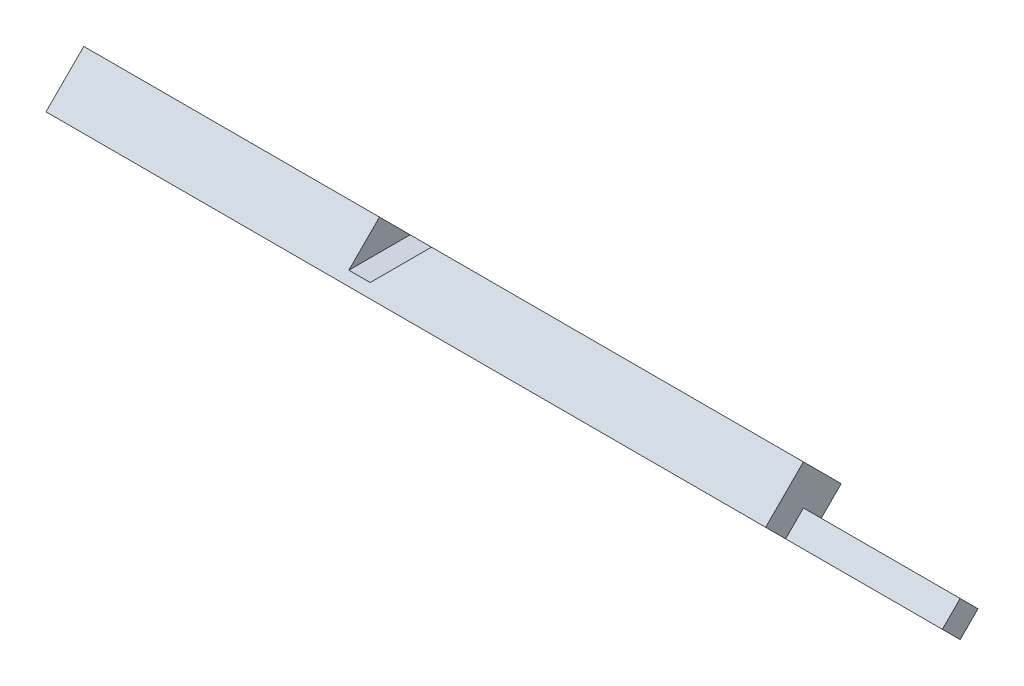
ISO-10303-21;
HEADER;
FILE_DESCRIPTION(('STEP AP214'),'2;1');
FILE_NAME('part.step','',(''),(''),'','','');
FILE_SCHEMA(('AUTOMOTIVE_DESIGN { 1 0 10303 214 1 1 1 1 }'));
ENDSEC;
DATA;
#1=APPLICATION_CONTEXT('core data for automotive mechanical design processes');
#2=APPLICATION_PROTOCOL_DEFINITION('international standard','automotive_design',2000,#1);
#3=PRODUCT_CONTEXT('',#1,'mechanical');
#4=PRODUCT('Part','Part','',(#3));
#5=PRODUCT_RELATED_PRODUCT_CATEGORY('part','',(#4));
#6=PRODUCT_DEFINITION_FORMATION('','',#4);
#7=PRODUCT_DEFINITION_CONTEXT('part definition',#1,'design');
#8=PRODUCT_DEFINITION('design','',#6,#7);
#9=PRODUCT_DEFINITION_SHAPE('','',#8);
#10=(LENGTH_UNIT() NAMED_UNIT(*) SI_UNIT(.MILLI.,.METRE.));
#11=(NAMED_UNIT(*) PLANE_ANGLE_UNIT() SI_UNIT($,.RADIAN.));
#12=(NAMED_UNIT(*) SI_UNIT($,.STERADIAN.) SOLID_ANGLE_UNIT());
#13=UNCERTAINTY_MEASURE_WITH_UNIT(LENGTH_MEASURE(1.E-05),#10,'distance_accuracy_value','');
#14=(GEOMETRIC_REPRESENTATION_CONTEXT(3) GLOBAL_UNCERTAINTY_ASSIGNED_CONTEXT((#13)) GLOBAL_UNIT_ASSIGNED_CONTEXT((#10,
#11,#12)) REPRESENTATION_CONTEXT('',''));
#15=CARTESIAN_POINT('',(0.,0.,0.));
#16=DIRECTION('',(0.,0.,1.));
#17=DIRECTION('',(1.,0.,0.));
#18=AXIS2_PLACEMENT_3D('',#15,#16,#17);
#19=CARTESIAN_POINT('',(101.,0.,-5.3033008588991));
#20=DIRECTION('',(0.,-0.707106781186548,0.707106781186547));
#21=DIRECTION('',(0.,-0.707106781186547,-0.707106781186548));
#22=AXIS2_PLACEMENT_3D('',#19,#20,#21);
#23=PLANE('',#22);
#24=DIRECTION('',(-1.,0.,0.));
#25=VECTOR('',#24,1.);
#26=CARTESIAN_POINT('',(0.,1.,-4.30330085889911));
#27=LINE('',#26,#25);
#28=CARTESIAN_POINT('',(44.5,1.,-4.30330085889911));
#29=VERTEX_POINT('',#28);
#30=CARTESIAN_POINT('',(41.5,1.,-4.30330085889911));
#31=VERTEX_POINT('',#30);
#32=EDGE_CURVE('E127',#29,#31,#27,.T.);
#33=ORIENTED_EDGE('',*,*,#32,.F.);
#34=DIRECTION('',(0.577350269189622,0.577350269189628,0.577350269189628));
#35=VECTOR('',#34,1.);
#36=CARTESIAN_POINT('',(62.6666666666664,19.1666666666666,13.8633658077675));
#37=LINE('',#36,#35);
#38=CARTESIAN_POINT('',(48.8033008588991,5.3033008588991,0.));
#39=VERTEX_POINT('',#38);
#40=EDGE_CURVE('E112',#29,#39,#37,.T.);
#41=ORIENTED_EDGE('',*,*,#40,.T.);
#42=DIRECTION('',(-1.,0.,0.));
#43=VECTOR('',#42,1.);
#44=CARTESIAN_POINT('',(101.,5.30330085889911,0.));
#45=LINE('',#44,#43);
#46=CARTESIAN_POINT('',(101.,5.30330085889911,0.));
#47=VERTEX_POINT('',#46);
#48=EDGE_CURVE('E41',#47,#39,#45,.T.);
#49=ORIENTED_EDGE('',*,*,#48,.F.);
#50=DIRECTION('',(0.,0.707106781186547,0.707106781186548));
#51=VECTOR('',#50,1.);
#52=CARTESIAN_POINT('',(101.,0.,-5.3033008588991));
#53=LINE('',#52,#51);
#54=CARTESIAN_POINT('',(101.,0.,-5.3033008588991));
#55=VERTEX_POINT('',#54);
#56=EDGE_CURVE('E154',#55,#47,#53,.T.);
#57=ORIENTED_EDGE('',*,*,#56,.F.);
#58=DIRECTION('',(-1.,0.,0.));
#59=VECTOR('',#58,1.);
#60=CARTESIAN_POINT('',(101.,0.,-5.3033008588991));
#61=LINE('',#60,#59);
#62=CARTESIAN_POINT('',(0.,0.,-5.3033008588991));
#63=VERTEX_POINT('',#62);
#64=EDGE_CURVE('E11',#55,#63,#61,.T.);
#65=ORIENTED_EDGE('',*,*,#64,.T.);
#66=DIRECTION('',(0.,0.707106781186547,0.707106781186548));
#67=VECTOR('',#66,1.);
#68=CARTESIAN_POINT('',(0.,0.,-5.3033008588991));
#69=LINE('',#68,#67);
#70=CARTESIAN_POINT('',(0.,5.30330085889911,0.));
#71=VERTEX_POINT('',#70);
#72=EDGE_CURVE('E145',#63,#71,#69,.T.);
#73=ORIENTED_EDGE('',*,*,#72,.T.);
#74=CARTESIAN_POINT('',(41.5,5.3033008588991,0.));
#75=VERTEX_POINT('',#74);
#76=EDGE_CURVE('E132',#75,#71,#45,.T.);
#77=ORIENTED_EDGE('',*,*,#76,.F.);
#78=DIRECTION('',(0.,-0.707106781186547,-0.707106781186548));
#79=VECTOR('',#78,1.);
#80=CARTESIAN_POINT('',(41.5,2.65215042944955,-2.65115042944955));
#81=LINE('',#80,#79);
#82=EDGE_CURVE('E186',#75,#31,#81,.T.);
#83=ORIENTED_EDGE('',*,*,#82,.T.);
#84=EDGE_LOOP('',(#33,#41,#49,#57,#65,#73,#77,#83));
#85=FACE_BOUND('',#84,.T.);
#86=ADVANCED_FACE('F33',(#85),#23,.F.);
#87=CARTESIAN_POINT('',(101.,5.30330085889911,0.));
#88=DIRECTION('',(0.,-0.707106781186547,-0.707106781186548));
#89=DIRECTION('',(0.,0.707106781186548,-0.707106781186547));
#90=AXIS2_PLACEMENT_3D('',#87,#88,#89);
#91=PLANE('',#90);
#92=ORIENTED_EDGE('',*,*,#48,.T.);
#93=DIRECTION('',(-0.577350269189622,-0.577350269189628,0.577350269189628));
#94=VECTOR('',#93,1.);
#95=CARTESIAN_POINT('',(66.2022005725991,22.7022005725994,-17.3988997137002));
#96=LINE('',#95,#94);
#97=CARTESIAN_POINT('',(44.5,1.,4.3033008588991));
#98=VERTEX_POINT('',#97);
#99=EDGE_CURVE('E109',#39,#98,#96,.T.);
#100=ORIENTED_EDGE('',*,*,#99,.T.);
#101=DIRECTION('',(1.,0.,0.));
#102=VECTOR('',#101,1.);
#103=CARTESIAN_POINT('',(0.,1.,4.30330085889911));
#104=LINE('',#103,#102);
#105=CARTESIAN_POINT('',(41.5,1.,4.30330085889911));
#106=VERTEX_POINT('',#105);
#107=EDGE_CURVE('E181',#106,#98,#104,.T.);
#108=ORIENTED_EDGE('',*,*,#107,.F.);
#109=DIRECTION('',(0.,0.707106781186548,-0.707106781186547));
#110=VECTOR('',#109,1.);
#111=CARTESIAN_POINT('',(41.5,7.95545128834866,-2.65215042944955));
#112=LINE('',#111,#110);
#113=EDGE_CURVE('E48',#106,#75,#112,.T.);
#114=ORIENTED_EDGE('',*,*,#113,.T.);
#115=ORIENTED_EDGE('',*,*,#76,.T.);
#116=DIRECTION('',(0.,-0.707106781186548,0.707106781186547));
#117=VECTOR('',#116,1.);
#118=CARTESIAN_POINT('',(0.,5.30330085889911,0.));
#119=LINE('',#118,#117);
#120=CARTESIAN_POINT('',(0.,0.,5.30330085889911));
#121=VERTEX_POINT('',#120);
#122=EDGE_CURVE('E143',#71,#121,#119,.T.);
#123=ORIENTED_EDGE('',*,*,#122,.T.);
#124=DIRECTION('',(-1.,0.,0.));
#125=VECTOR('',#124,1.);
#126=CARTESIAN_POINT('',(101.,0.,5.30330085889911));
#127=LINE('',#126,#125);
#128=CARTESIAN_POINT('',(101.,0.,5.30330085889911));
#129=VERTEX_POINT('',#128);
#130=EDGE_CURVE('E133',#129,#121,#127,.T.);
#131=ORIENTED_EDGE('',*,*,#130,.F.);
#132=DIRECTION('',(0.,-0.707106781186548,0.707106781186547));
#133=VECTOR('',#132,1.);
#134=CARTESIAN_POINT('',(101.,5.30330085889911,0.));
#135=LINE('',#134,#133);
#136=EDGE_CURVE('E131',#47,#129,#135,.T.);
#137=ORIENTED_EDGE('',*,*,#136,.F.);
#138=EDGE_LOOP('',(#92,#100,#108,#114,#115,#123,#131,#137));
#139=FACE_BOUND('',#138,.T.);
#140=ADVANCED_FACE('F129',(#139),#91,.F.);
#141=CARTESIAN_POINT('',(101.,0.,0.));
#142=DIRECTION('',(-1.,0.,0.));
#143=DIRECTION('',(0.,0.,1.));
#144=AXIS2_PLACEMENT_3D('',#141,#142,#143);
#145=PLANE('',#144);
#146=DIRECTION('',(0.,-0.707106781186548,0.707106781186547));
#147=VECTOR('',#146,1.);
#148=CARTESIAN_POINT('',(101.,-2.80330085889911,2.5));
#149=LINE('',#148,#147);
#150=CARTESIAN_POINT('',(101.,-0.303300858899107,0.));
#151=VERTEX_POINT('',#150);
#152=CARTESIAN_POINT('',(101.,-2.80330085889911,2.5));
#153=VERTEX_POINT('',#152);
#154=EDGE_CURVE('E166',#151,#153,#149,.T.);
#155=ORIENTED_EDGE('',*,*,#154,.F.);
#156=DIRECTION('',(0.,0.707106781186548,0.707106781186548));
#157=VECTOR('',#156,1.);
#158=CARTESIAN_POINT('',(101.,-2.80330085889911,-2.5));
#159=LINE('',#158,#157);
#160=CARTESIAN_POINT('',(101.,-2.80330085889911,-2.5));
#161=VERTEX_POINT('',#160);
#162=EDGE_CURVE('E169',#161,#151,#159,.T.);
#163=ORIENTED_EDGE('',*,*,#162,.F.);
#164=DIRECTION('',(0.,0.707106781186548,-0.707106781186547));
#165=VECTOR('',#164,1.);
#166=CARTESIAN_POINT('',(101.,0.,-5.3033008588991));
#167=LINE('',#166,#165);
#168=EDGE_CURVE('E142',#161,#55,#167,.T.);
#169=ORIENTED_EDGE('',*,*,#168,.T.);
#170=ORIENTED_EDGE('',*,*,#56,.T.);
#171=ORIENTED_EDGE('',*,*,#136,.T.);
#172=DIRECTION('',(0.,-0.707106781186547,-0.707106781186548));
#173=VECTOR('',#172,1.);
#174=CARTESIAN_POINT('',(101.,-5.30330085889911,0.));
#175=LINE('',#174,#173);
#176=EDGE_CURVE('E56',#129,#153,#175,.T.);
#177=ORIENTED_EDGE('',*,*,#176,.T.);
#178=EDGE_LOOP('',(#155,#163,#169,#170,#171,#177));
#179=FACE_BOUND('',#178,.T.);
#180=ADVANCED_FACE('F203',(#179),#145,.F.);
#181=CARTESIAN_POINT('',(101.,0.,-5.3033008588991));
#182=DIRECTION('',(0.,0.707106781186547,0.707106781186548));
#183=DIRECTION('',(0.,-0.707106781186548,0.707106781186547));
#184=AXIS2_PLACEMENT_3D('',#181,#182,#183);
#185=PLANE('',#184);
#186=DIRECTION('',(0.,0.707106781186548,-0.707106781186547));
#187=VECTOR('',#186,1.);
#188=CARTESIAN_POINT('',(0.,0.,-5.3033008588991));
#189=LINE('',#188,#187);
#190=CARTESIAN_POINT('',(0.,-5.30330085889911,0.));
#191=VERTEX_POINT('',#190);
#192=EDGE_CURVE('E148',#191,#63,#189,.T.);
#193=ORIENTED_EDGE('',*,*,#192,.T.);
#194=ORIENTED_EDGE('',*,*,#64,.F.);
#195=ORIENTED_EDGE('',*,*,#168,.F.);
#196=DIRECTION('',(-1.,0.,0.));
#197=VECTOR('',#196,1.);
#198=CARTESIAN_POINT('',(123.,-2.80330085889911,-2.5));
#199=LINE('',#198,#197);
#200=CARTESIAN_POINT('',(123.,-2.80330085889911,-2.5));
#201=VERTEX_POINT('',#200);
#202=EDGE_CURVE('E151',#201,#161,#199,.T.);
#203=ORIENTED_EDGE('',*,*,#202,.F.);
#204=DIRECTION('',(0.,0.707106781186548,-0.707106781186547));
#205=VECTOR('',#204,1.);
#206=CARTESIAN_POINT('',(123.,-5.30330085889911,0.));
#207=LINE('',#206,#205);
#208=CARTESIAN_POINT('',(123.,-5.30330085889911,0.));
#209=VERTEX_POINT('',#208);
#210=EDGE_CURVE('E168',#209,#201,#207,.T.);
#211=ORIENTED_EDGE('',*,*,#210,.F.);
#212=DIRECTION('',(-1.,0.,0.));
#213=VECTOR('',#212,1.);
#214=CARTESIAN_POINT('',(101.,-5.30330085889911,0.));
#215=LINE('',#214,#213);
#216=EDGE_CURVE('E137',#209,#191,#215,.T.);
#217=ORIENTED_EDGE('',*,*,#216,.T.);
#218=EDGE_LOOP('',(#193,#194,#195,#203,#211,#217));
#219=FACE_BOUND('',#218,.T.);
#220=ADVANCED_FACE('F35',(#219),#185,.F.);
#221=CARTESIAN_POINT('',(101.,-5.30330085889911,0.));
#222=DIRECTION('',(0.,0.707106781186548,-0.707106781186547));
#223=DIRECTION('',(0.,0.707106781186547,0.707106781186548));
#224=AXIS2_PLACEMENT_3D('',#221,#222,#223);
#225=PLANE('',#224);
#226=DIRECTION('',(0.,-0.707106781186547,-0.707106781186548));
#227=VECTOR('',#226,1.);
#228=CARTESIAN_POINT('',(0.,-5.30330085889911,0.));
#229=LINE('',#228,#227);
#230=EDGE_CURVE('E140',#121,#191,#229,.T.);
#231=ORIENTED_EDGE('',*,*,#230,.T.);
#232=ORIENTED_EDGE('',*,*,#216,.F.);
#233=DIRECTION('',(0.,-0.707106781186547,-0.707106781186548));
#234=VECTOR('',#233,1.);
#235=CARTESIAN_POINT('',(123.,-5.30330085889911,0.));
#236=LINE('',#235,#234);
#237=CARTESIAN_POINT('',(123.,-2.80330085889911,2.5));
#238=VERTEX_POINT('',#237);
#239=EDGE_CURVE('E165',#238,#209,#236,.T.);
#240=ORIENTED_EDGE('',*,*,#239,.F.);
#241=DIRECTION('',(-1.,0.,0.));
#242=VECTOR('',#241,1.);
#243=CARTESIAN_POINT('',(123.,-2.80330085889911,2.5));
#244=LINE('',#243,#242);
#245=EDGE_CURVE('E162',#238,#153,#244,.T.);
#246=ORIENTED_EDGE('',*,*,#245,.T.);
#247=ORIENTED_EDGE('',*,*,#176,.F.);
#248=ORIENTED_EDGE('',*,*,#130,.T.);
#249=EDGE_LOOP('',(#231,#232,#240,#246,#247,#248));
#250=FACE_BOUND('',#249,.T.);
#251=ADVANCED_FACE('F196',(#250),#225,.F.);
#252=CARTESIAN_POINT('',(0.,0.,0.));
#253=DIRECTION('',(-1.,0.,0.));
#254=DIRECTION('',(0.,0.,1.));
#255=AXIS2_PLACEMENT_3D('',#252,#253,#254);
#256=PLANE('',#255);
#257=ORIENTED_EDGE('',*,*,#192,.F.);
#258=ORIENTED_EDGE('',*,*,#230,.F.);
#259=ORIENTED_EDGE('',*,*,#122,.F.);
#260=ORIENTED_EDGE('',*,*,#72,.F.);
#261=EDGE_LOOP('',(#257,#258,#259,#260));
#262=FACE_BOUND('',#261,.T.);
#263=ADVANCED_FACE('F194',(#262),#256,.T.);
#264=CARTESIAN_POINT('',(123.,-2.80330085889911,-2.5));
#265=DIRECTION('',(0.,-0.707106781186548,0.707106781186548));
#266=DIRECTION('',(0.,-0.707106781186548,-0.707106781186548));
#267=AXIS2_PLACEMENT_3D('',#264,#265,#266);
#268=PLANE('',#267);
#269=ORIENTED_EDGE('',*,*,#162,.T.);
#270=DIRECTION('',(-1.,0.,0.));
#271=VECTOR('',#270,1.);
#272=CARTESIAN_POINT('',(123.,-0.303300858899107,0.));
#273=LINE('',#272,#271);
#274=CARTESIAN_POINT('',(123.,-0.303300858899107,0.));
#275=VERTEX_POINT('',#274);
#276=EDGE_CURVE('E159',#275,#151,#273,.T.);
#277=ORIENTED_EDGE('',*,*,#276,.F.);
#278=DIRECTION('',(0.,0.707106781186548,0.707106781186548));
#279=VECTOR('',#278,1.);
#280=CARTESIAN_POINT('',(123.,-2.80330085889911,-2.5));
#281=LINE('',#280,#279);
#282=EDGE_CURVE('E176',#201,#275,#281,.T.);
#283=ORIENTED_EDGE('',*,*,#282,.F.);
#284=ORIENTED_EDGE('',*,*,#202,.T.);
#285=EDGE_LOOP('',(#269,#277,#283,#284));
#286=FACE_BOUND('',#285,.T.);
#287=ADVANCED_FACE('F206',(#286),#268,.F.);
#288=CARTESIAN_POINT('',(123.,-2.80330085889911,2.5));
#289=DIRECTION('',(0.,-0.707106781186547,-0.707106781186548));
#290=DIRECTION('',(0.,0.707106781186548,-0.707106781186547));
#291=AXIS2_PLACEMENT_3D('',#288,#289,#290);
#292=PLANE('',#291);
#293=ORIENTED_EDGE('',*,*,#154,.T.);
#294=ORIENTED_EDGE('',*,*,#245,.F.);
#295=DIRECTION('',(0.,-0.707106781186548,0.707106781186547));
#296=VECTOR('',#295,1.);
#297=CARTESIAN_POINT('',(123.,-2.80330085889911,2.5));
#298=LINE('',#297,#296);
#299=EDGE_CURVE('E174',#275,#238,#298,.T.);
#300=ORIENTED_EDGE('',*,*,#299,.F.);
#301=ORIENTED_EDGE('',*,*,#276,.T.);
#302=EDGE_LOOP('',(#293,#294,#300,#301));
#303=FACE_BOUND('',#302,.T.);
#304=ADVANCED_FACE('F201',(#303),#292,.F.);
#305=CARTESIAN_POINT('',(123.,0.,0.));
#306=DIRECTION('',(1.,0.,0.));
#307=DIRECTION('',(0.,0.,-1.));
#308=AXIS2_PLACEMENT_3D('',#305,#306,#307);
#309=PLANE('',#308);
#310=ORIENTED_EDGE('',*,*,#210,.T.);
#311=ORIENTED_EDGE('',*,*,#282,.T.);
#312=ORIENTED_EDGE('',*,*,#299,.T.);
#313=ORIENTED_EDGE('',*,*,#239,.T.);
#314=EDGE_LOOP('',(#310,#311,#312,#313));
#315=FACE_BOUND('',#314,.T.);
#316=ADVANCED_FACE('F211',(#315),#309,.T.);
#317=CARTESIAN_POINT('',(41.5,5.30430085889911,-5.3033008588991));
#318=DIRECTION('',(1.,0.,0.));
#319=DIRECTION('',(0.,0.,-1.));
#320=AXIS2_PLACEMENT_3D('',#317,#318,#319);
#321=PLANE('',#320);
#322=ORIENTED_EDGE('',*,*,#113,.F.);
#323=DIRECTION('',(0.,0.,1.));
#324=VECTOR('',#323,1.);
#325=CARTESIAN_POINT('',(41.5,1.,-5.3033008588991));
#326=LINE('',#325,#324);
#327=EDGE_CURVE('E184',#31,#106,#326,.T.);
#328=ORIENTED_EDGE('',*,*,#327,.F.);
#329=ORIENTED_EDGE('',*,*,#82,.F.);
#330=EDGE_LOOP('',(#322,#328,#329));
#331=FACE_BOUND('',#330,.T.);
#332=ADVANCED_FACE('F213',(#331),#321,.T.);
#333=CARTESIAN_POINT('',(0.,1.,0.));
#334=DIRECTION('',(0.,-1.,0.));
#335=DIRECTION('',(0.,0.,-1.));
#336=AXIS2_PLACEMENT_3D('',#333,#334,#335);
#337=PLANE('',#336);
#338=ORIENTED_EDGE('',*,*,#32,.T.);
#339=ORIENTED_EDGE('',*,*,#327,.T.);
#340=ORIENTED_EDGE('',*,*,#107,.T.);
#341=DIRECTION('',(0.,0.,-1.));
#342=VECTOR('',#341,1.);
#343=CARTESIAN_POINT('',(44.5,1.,-5.3033008588991));
#344=LINE('',#343,#342);
#345=EDGE_CURVE('E114',#98,#29,#344,.T.);
#346=ORIENTED_EDGE('',*,*,#345,.T.);
#347=EDGE_LOOP('',(#338,#339,#340,#346));
#348=FACE_BOUND('',#347,.T.);
#349=ADVANCED_FACE('F219',(#348),#337,.F.);
#350=CARTESIAN_POINT('',(44.5,1.,-5.3033008588991));
#351=DIRECTION('',(0.707106781186551,-0.707106781186544,0.));
#352=DIRECTION('',(0.707106781186544,0.707106781186551,0.));
#353=AXIS2_PLACEMENT_3D('',#350,#351,#352);
#354=PLANE('',#353);
#355=ORIENTED_EDGE('',*,*,#345,.F.);
#356=ORIENTED_EDGE('',*,*,#99,.F.);
#357=ORIENTED_EDGE('',*,*,#40,.F.);
#358=EDGE_LOOP('',(#355,#356,#357));
#359=FACE_BOUND('',#358,.T.);
#360=ADVANCED_FACE('F111',(#359),#354,.F.);
#361=CLOSED_SHELL('',(#86,#140,#180,#220,#251,#263,#287,#304,#316,#332,#349,#360));
#362=MANIFOLD_SOLID_BREP('B2',#361);
#363=ADVANCED_BREP_SHAPE_REPRESENTATION('',(#18,#362),#14);
#364=SHAPE_DEFINITION_REPRESENTATION(#9,#363);
ENDSEC;
END-ISO-10303-21;
